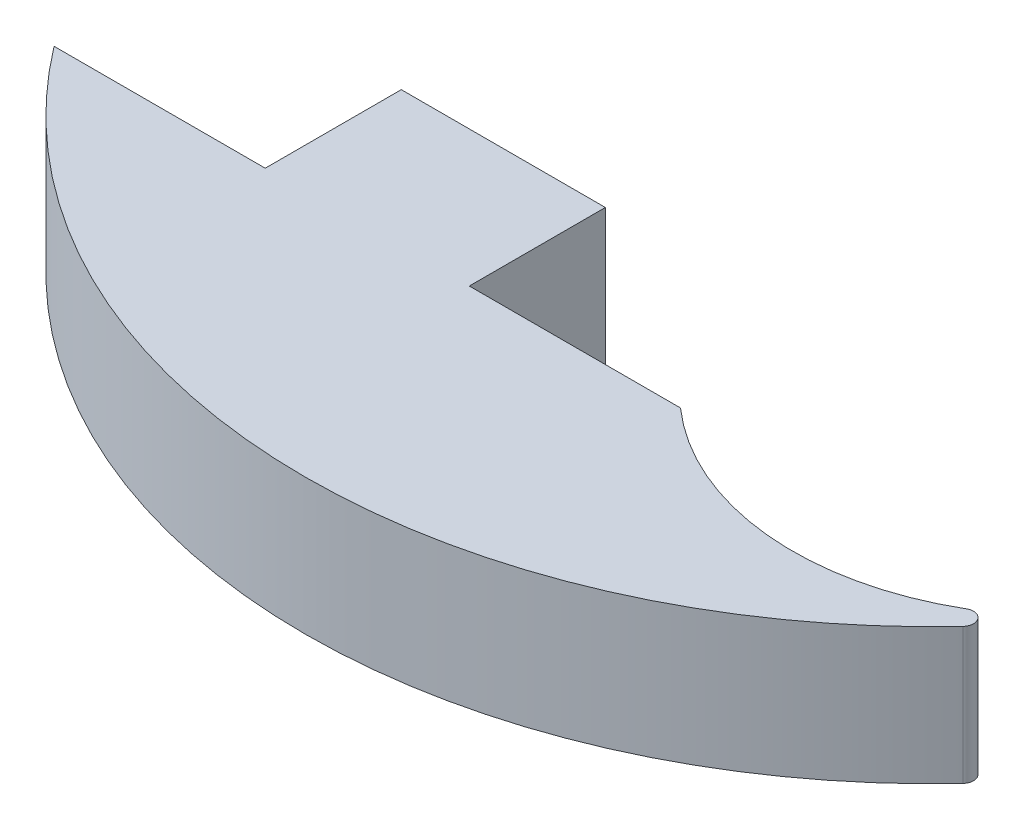
ISO-10303-21;
HEADER;
FILE_DESCRIPTION(('STEP AP214'),'2;1');
FILE_NAME('part.step','',(''),(''),'','','');
FILE_SCHEMA(('AUTOMOTIVE_DESIGN { 1 0 10303 214 1 1 1 1 }'));
ENDSEC;
DATA;
#1=APPLICATION_CONTEXT('core data for automotive mechanical design processes');
#2=APPLICATION_PROTOCOL_DEFINITION('international standard','automotive_design',2000,#1);
#3=PRODUCT_CONTEXT('',#1,'mechanical');
#4=PRODUCT('Part','Part','',(#3));
#5=PRODUCT_RELATED_PRODUCT_CATEGORY('part','',(#4));
#6=PRODUCT_DEFINITION_FORMATION('','',#4);
#7=PRODUCT_DEFINITION_CONTEXT('part definition',#1,'design');
#8=PRODUCT_DEFINITION('design','',#6,#7);
#9=PRODUCT_DEFINITION_SHAPE('','',#8);
#10=(LENGTH_UNIT() NAMED_UNIT(*) SI_UNIT(.MILLI.,.METRE.));
#11=(NAMED_UNIT(*) PLANE_ANGLE_UNIT() SI_UNIT($,.RADIAN.));
#12=(NAMED_UNIT(*) SI_UNIT($,.STERADIAN.) SOLID_ANGLE_UNIT());
#13=UNCERTAINTY_MEASURE_WITH_UNIT(LENGTH_MEASURE(1.E-05),#10,'distance_accuracy_value','');
#14=(GEOMETRIC_REPRESENTATION_CONTEXT(3) GLOBAL_UNCERTAINTY_ASSIGNED_CONTEXT((#13)) GLOBAL_UNIT_ASSIGNED_CONTEXT((#10,
#11,#12)) REPRESENTATION_CONTEXT('',''));
#15=CARTESIAN_POINT('',(0.,0.,0.));
#16=DIRECTION('',(0.,0.,1.));
#17=DIRECTION('',(1.,0.,0.));
#18=AXIS2_PLACEMENT_3D('',#15,#16,#17);
#19=CARTESIAN_POINT('',(-30.9334786787038,3.175,25.5235804279632));
#20=DIRECTION('',(0.,-1.,0.));
#21=DIRECTION('',(0.,0.,-1.));
#22=AXIS2_PLACEMENT_3D('',#19,#20,#21);
#23=CYLINDRICAL_SURFACE('',#22,29.21);
#24=CARTESIAN_POINT('',(-30.9334786787038,-3.175,25.5235804279632));
#25=DIRECTION('',(0.,1.,0.));
#26=DIRECTION('',(0.,0.,1.));
#27=AXIS2_PLACEMENT_3D('',#24,#25,#26);
#28=CIRCLE('',#27,29.21);
#29=CARTESIAN_POINT('',(-9.53962414429852,-3.175,45.411443263389));
#30=VERTEX_POINT('',#29);
#31=CARTESIAN_POINT('',(-54.2024432577782,-3.175,43.1808561922985));
#32=VERTEX_POINT('',#31);
#33=EDGE_CURVE('E119',#30,#32,#28,.F.);
#34=ORIENTED_EDGE('',*,*,#33,.F.);
#35=DIRECTION('',(0.,1.,0.));
#36=VECTOR('',#35,1.);
#37=CARTESIAN_POINT('',(-9.53962414429852,-3.175,45.411443263389));
#38=LINE('',#37,#36);
#39=CARTESIAN_POINT('',(-9.53962414429852,3.175,45.411443263389));
#40=VERTEX_POINT('',#39);
#41=EDGE_CURVE('E50',#30,#40,#38,.T.);
#42=ORIENTED_EDGE('',*,*,#41,.T.);
#43=CARTESIAN_POINT('',(-30.9334786787038,3.175,25.5235804279632));
#44=DIRECTION('',(0.,1.,0.));
#45=DIRECTION('',(0.,0.,1.));
#46=AXIS2_PLACEMENT_3D('',#43,#44,#45);
#47=CIRCLE('',#46,29.21);
#48=CARTESIAN_POINT('',(-54.2024432577782,3.175,43.1808561922985));
#49=VERTEX_POINT('',#48);
#50=EDGE_CURVE('E127',#40,#49,#47,.F.);
#51=ORIENTED_EDGE('',*,*,#50,.T.);
#52=DIRECTION('',(0.,-1.,0.));
#53=VECTOR('',#52,1.);
#54=CARTESIAN_POINT('',(-54.2024432577782,3.175,43.1808561922985));
#55=LINE('',#54,#53);
#56=EDGE_CURVE('E43',#49,#32,#55,.T.);
#57=ORIENTED_EDGE('',*,*,#56,.T.);
#58=EDGE_LOOP('',(#34,#42,#51,#57));
#59=FACE_BOUND('',#58,.T.);
#60=ADVANCED_FACE('F36',(#59),#23,.T.);
#61=CARTESIAN_POINT('',(0.,3.175,0.));
#62=DIRECTION('',(0.,1.,0.));
#63=DIRECTION('',(0.,0.,1.));
#64=AXIS2_PLACEMENT_3D('',#61,#62,#63);
#65=PLANE('',#64);
#66=CARTESIAN_POINT('',(-9.91169117967949,3.175,45.0655673879902));
#67=DIRECTION('',(0.,1.,0.));
#68=DIRECTION('',(0.,0.,1.));
#69=AXIS2_PLACEMENT_3D('',#66,#67,#68);
#70=CIRCLE('',#69,0.508000000000001);
#71=CARTESIAN_POINT('',(-10.1675970264525,3.175,44.6267323420021));
#72=VERTEX_POINT('',#71);
#73=EDGE_CURVE('E105',#72,#40,#70,.F.);
#74=ORIENTED_EDGE('',*,*,#73,.F.);
#75=CARTESIAN_POINT('',(-16.5652431957789,3.175,33.6558561923));
#76=DIRECTION('',(0.,1.,0.));
#77=DIRECTION('',(0.,0.,1.));
#78=AXIS2_PLACEMENT_3D('',#75,#76,#77);
#79=CIRCLE('',#78,12.7);
#80=CARTESIAN_POINT('',(-24.9655036084107,3.175,43.1808561922985));
#81=VERTEX_POINT('',#80);
#82=EDGE_CURVE('E114',#81,#72,#79,.T.);
#83=ORIENTED_EDGE('',*,*,#82,.F.);
#84=DIRECTION('',(1.,0.,0.));
#85=VECTOR('',#84,1.);
#86=CARTESIAN_POINT('',(0.,3.175,43.1808561922985));
#87=LINE('',#86,#85);
#88=CARTESIAN_POINT('',(-34.8214734330945,3.175,43.1808561922985));
#89=VERTEX_POINT('',#88);
#90=EDGE_CURVE('E134',#89,#81,#87,.T.);
#91=ORIENTED_EDGE('',*,*,#90,.F.);
#92=DIRECTION('',(0.,0.,-1.));
#93=VECTOR('',#92,1.);
#94=CARTESIAN_POINT('',(-34.8214734330945,3.175,0.));
#95=LINE('',#94,#93);
#96=CARTESIAN_POINT('',(-34.8214734330945,3.175,36.8308561922998));
#97=VERTEX_POINT('',#96);
#98=EDGE_CURVE('E154',#89,#97,#95,.T.);
#99=ORIENTED_EDGE('',*,*,#98,.T.);
#100=DIRECTION('',(-1.,0.,0.));
#101=VECTOR('',#100,1.);
#102=CARTESIAN_POINT('',(0.,3.175,36.8308561922998));
#103=LINE('',#102,#101);
#104=CARTESIAN_POINT('',(-44.3464734330945,3.175,36.8308561922998));
#105=VERTEX_POINT('',#104);
#106=EDGE_CURVE('E150',#97,#105,#103,.T.);
#107=ORIENTED_EDGE('',*,*,#106,.T.);
#108=DIRECTION('',(0.,0.,-1.));
#109=VECTOR('',#108,1.);
#110=CARTESIAN_POINT('',(-44.3464734330945,3.175,0.));
#111=LINE('',#110,#109);
#112=CARTESIAN_POINT('',(-44.3464734330945,3.175,43.1808561922985));
#113=VERTEX_POINT('',#112);
#114=EDGE_CURVE('E157',#113,#105,#111,.T.);
#115=ORIENTED_EDGE('',*,*,#114,.F.);
#116=EDGE_CURVE('E129',#49,#113,#87,.T.);
#117=ORIENTED_EDGE('',*,*,#116,.F.);
#118=ORIENTED_EDGE('',*,*,#50,.F.);
#119=EDGE_LOOP('',(#74,#83,#91,#99,#107,#115,#117,#118));
#120=FACE_BOUND('',#119,.T.);
#121=ADVANCED_FACE('F167',(#120),#65,.T.);
#122=CARTESIAN_POINT('',(0.,-3.175,0.));
#123=DIRECTION('',(0.,1.,0.));
#124=DIRECTION('',(0.,0.,1.));
#125=AXIS2_PLACEMENT_3D('',#122,#123,#124);
#126=PLANE('',#125);
#127=CARTESIAN_POINT('',(-16.5652431957789,-3.175,33.6558561923));
#128=DIRECTION('',(0.,1.,0.));
#129=DIRECTION('',(0.,0.,1.));
#130=AXIS2_PLACEMENT_3D('',#127,#128,#129);
#131=CIRCLE('',#130,12.7);
#132=CARTESIAN_POINT('',(-24.9655036084107,-3.175,43.1808561922985));
#133=VERTEX_POINT('',#132);
#134=CARTESIAN_POINT('',(-10.1675970264525,-3.175,44.6267323420021));
#135=VERTEX_POINT('',#134);
#136=EDGE_CURVE('E112',#133,#135,#131,.T.);
#137=ORIENTED_EDGE('',*,*,#136,.T.);
#138=CARTESIAN_POINT('',(-9.91169117967949,-3.175,45.0655673879902));
#139=DIRECTION('',(0.,1.,0.));
#140=DIRECTION('',(0.,0.,1.));
#141=AXIS2_PLACEMENT_3D('',#138,#139,#140);
#142=CIRCLE('',#141,0.508000000000001);
#143=EDGE_CURVE('E98',#135,#30,#142,.F.);
#144=ORIENTED_EDGE('',*,*,#143,.T.);
#145=ORIENTED_EDGE('',*,*,#33,.T.);
#146=DIRECTION('',(1.,0.,0.));
#147=VECTOR('',#146,1.);
#148=CARTESIAN_POINT('',(0.,-3.175,43.1808561922985));
#149=LINE('',#148,#147);
#150=CARTESIAN_POINT('',(-44.3464734330945,-3.175,43.1808561922985));
#151=VERTEX_POINT('',#150);
#152=EDGE_CURVE('E121',#32,#151,#149,.T.);
#153=ORIENTED_EDGE('',*,*,#152,.T.);
#154=DIRECTION('',(0.,0.,-1.));
#155=VECTOR('',#154,1.);
#156=CARTESIAN_POINT('',(-44.3464734330945,-3.175,0.));
#157=LINE('',#156,#155);
#158=CARTESIAN_POINT('',(-44.3464734330945,-3.175,36.8308561922998));
#159=VERTEX_POINT('',#158);
#160=EDGE_CURVE('E153',#151,#159,#157,.T.);
#161=ORIENTED_EDGE('',*,*,#160,.T.);
#162=DIRECTION('',(-1.,0.,0.));
#163=VECTOR('',#162,1.);
#164=CARTESIAN_POINT('',(0.,-3.175,36.8308561922998));
#165=LINE('',#164,#163);
#166=CARTESIAN_POINT('',(-34.8214734330945,-3.175,36.8308561922998));
#167=VERTEX_POINT('',#166);
#168=EDGE_CURVE('E144',#167,#159,#165,.T.);
#169=ORIENTED_EDGE('',*,*,#168,.F.);
#170=DIRECTION('',(0.,0.,-1.));
#171=VECTOR('',#170,1.);
#172=CARTESIAN_POINT('',(-34.8214734330945,-3.175,0.));
#173=LINE('',#172,#171);
#174=CARTESIAN_POINT('',(-34.8214734330945,-3.175,43.1808561922985));
#175=VERTEX_POINT('',#174);
#176=EDGE_CURVE('E58',#175,#167,#173,.T.);
#177=ORIENTED_EDGE('',*,*,#176,.F.);
#178=EDGE_CURVE('E118',#175,#133,#149,.T.);
#179=ORIENTED_EDGE('',*,*,#178,.T.);
#180=EDGE_LOOP('',(#137,#144,#145,#153,#161,#169,#177,#179));
#181=FACE_BOUND('',#180,.T.);
#182=ADVANCED_FACE('F116',(#181),#126,.F.);
#183=CARTESIAN_POINT('',(0.,3.175,43.1808561922985));
#184=DIRECTION('',(0.,0.,-1.));
#185=DIRECTION('',(-1.,0.,0.));
#186=AXIS2_PLACEMENT_3D('',#183,#184,#185);
#187=PLANE('',#186);
#188=ORIENTED_EDGE('',*,*,#116,.T.);
#189=DIRECTION('',(0.,1.,0.));
#190=VECTOR('',#189,1.);
#191=CARTESIAN_POINT('',(-44.3464734330945,-3.175,43.1808561922985));
#192=LINE('',#191,#190);
#193=EDGE_CURVE('E141',#151,#113,#192,.T.);
#194=ORIENTED_EDGE('',*,*,#193,.F.);
#195=ORIENTED_EDGE('',*,*,#152,.F.);
#196=ORIENTED_EDGE('',*,*,#56,.F.);
#197=EDGE_LOOP('',(#188,#194,#195,#196));
#198=FACE_BOUND('',#197,.T.);
#199=ADVANCED_FACE('F173',(#198),#187,.T.);
#200=CARTESIAN_POINT('',(-16.5652431957789,3.175,33.6558561923));
#201=DIRECTION('',(0.,-1.,0.));
#202=DIRECTION('',(0.,0.,-1.));
#203=AXIS2_PLACEMENT_3D('',#200,#201,#202);
#204=CYLINDRICAL_SURFACE('',#203,12.7);
#205=DIRECTION('',(0.,1.,0.));
#206=VECTOR('',#205,1.);
#207=CARTESIAN_POINT('',(-10.1675970264525,-3.175,44.6267323420021));
#208=LINE('',#207,#206);
#209=EDGE_CURVE('E101',#135,#72,#208,.T.);
#210=ORIENTED_EDGE('',*,*,#209,.F.);
#211=ORIENTED_EDGE('',*,*,#136,.F.);
#212=DIRECTION('',(0.,-1.,0.));
#213=VECTOR('',#212,1.);
#214=CARTESIAN_POINT('',(-24.9655036084107,3.175,43.1808561922985));
#215=LINE('',#214,#213);
#216=EDGE_CURVE('E11',#81,#133,#215,.T.);
#217=ORIENTED_EDGE('',*,*,#216,.F.);
#218=ORIENTED_EDGE('',*,*,#82,.T.);
#219=EDGE_LOOP('',(#210,#211,#217,#218));
#220=FACE_BOUND('',#219,.T.);
#221=ADVANCED_FACE('F110',(#220),#204,.F.);
#222=DIRECTION('',(0.,1.,0.));
#223=VECTOR('',#222,1.);
#224=CARTESIAN_POINT('',(-34.8214734330945,-3.175,43.1808561922985));
#225=LINE('',#224,#223);
#226=EDGE_CURVE('E143',#175,#89,#225,.T.);
#227=ORIENTED_EDGE('',*,*,#226,.T.);
#228=ORIENTED_EDGE('',*,*,#90,.T.);
#229=ORIENTED_EDGE('',*,*,#216,.T.);
#230=ORIENTED_EDGE('',*,*,#178,.F.);
#231=EDGE_LOOP('',(#227,#228,#229,#230));
#232=FACE_BOUND('',#231,.T.);
#233=ADVANCED_FACE('F180',(#232),#187,.T.);
#234=CARTESIAN_POINT('',(-44.3464734330945,-3.175,0.));
#235=DIRECTION('',(1.,0.,0.));
#236=DIRECTION('',(0.,0.,-1.));
#237=AXIS2_PLACEMENT_3D('',#234,#235,#236);
#238=PLANE('',#237);
#239=ORIENTED_EDGE('',*,*,#114,.T.);
#240=DIRECTION('',(0.,1.,0.));
#241=VECTOR('',#240,1.);
#242=CARTESIAN_POINT('',(-44.3464734330945,-3.175,36.8308561922998));
#243=LINE('',#242,#241);
#244=EDGE_CURVE('E123',#159,#105,#243,.T.);
#245=ORIENTED_EDGE('',*,*,#244,.F.);
#246=ORIENTED_EDGE('',*,*,#160,.F.);
#247=ORIENTED_EDGE('',*,*,#193,.T.);
#248=EDGE_LOOP('',(#239,#245,#246,#247));
#249=FACE_BOUND('',#248,.T.);
#250=ADVANCED_FACE('F172',(#249),#238,.F.);
#251=CARTESIAN_POINT('',(0.,-3.175,36.8308561922998));
#252=DIRECTION('',(0.,0.,-1.));
#253=DIRECTION('',(-1.,0.,0.));
#254=AXIS2_PLACEMENT_3D('',#251,#252,#253);
#255=PLANE('',#254);
#256=ORIENTED_EDGE('',*,*,#106,.F.);
#257=DIRECTION('',(0.,1.,0.));
#258=VECTOR('',#257,1.);
#259=CARTESIAN_POINT('',(-34.8214734330945,-3.175,36.8308561922998));
#260=LINE('',#259,#258);
#261=EDGE_CURVE('E147',#167,#97,#260,.T.);
#262=ORIENTED_EDGE('',*,*,#261,.F.);
#263=ORIENTED_EDGE('',*,*,#168,.T.);
#264=ORIENTED_EDGE('',*,*,#244,.T.);
#265=EDGE_LOOP('',(#256,#262,#263,#264));
#266=FACE_BOUND('',#265,.T.);
#267=ADVANCED_FACE('F175',(#266),#255,.T.);
#268=CARTESIAN_POINT('',(-34.8214734330945,-3.175,0.));
#269=DIRECTION('',(1.,0.,0.));
#270=DIRECTION('',(0.,0.,-1.));
#271=AXIS2_PLACEMENT_3D('',#268,#269,#270);
#272=PLANE('',#271);
#273=ORIENTED_EDGE('',*,*,#98,.F.);
#274=ORIENTED_EDGE('',*,*,#226,.F.);
#275=ORIENTED_EDGE('',*,*,#176,.T.);
#276=ORIENTED_EDGE('',*,*,#261,.T.);
#277=EDGE_LOOP('',(#273,#274,#275,#276));
#278=FACE_BOUND('',#277,.T.);
#279=ADVANCED_FACE('F177',(#278),#272,.T.);
#280=CARTESIAN_POINT('',(-9.91169117967949,-3.175,45.0655673879902));
#281=DIRECTION('',(0.,1.,0.));
#282=DIRECTION('',(0.,0.,1.));
#283=AXIS2_PLACEMENT_3D('',#280,#281,#282);
#284=CYLINDRICAL_SURFACE('',#283,0.508000000000001);
#285=ORIENTED_EDGE('',*,*,#73,.T.);
#286=ORIENTED_EDGE('',*,*,#41,.F.);
#287=ORIENTED_EDGE('',*,*,#143,.F.);
#288=ORIENTED_EDGE('',*,*,#209,.T.);
#289=EDGE_LOOP('',(#285,#286,#287,#288));
#290=FACE_BOUND('',#289,.T.);
#291=ADVANCED_FACE('F100',(#290),#284,.T.);
#292=CLOSED_SHELL('',(#60,#121,#182,#199,#221,#233,#250,#267,#279,#291));
#293=MANIFOLD_SOLID_BREP('B2',#292);
#294=ADVANCED_BREP_SHAPE_REPRESENTATION('',(#18,#293),#14);
#295=SHAPE_DEFINITION_REPRESENTATION(#9,#294);
ENDSEC;
END-ISO-10303-21;
